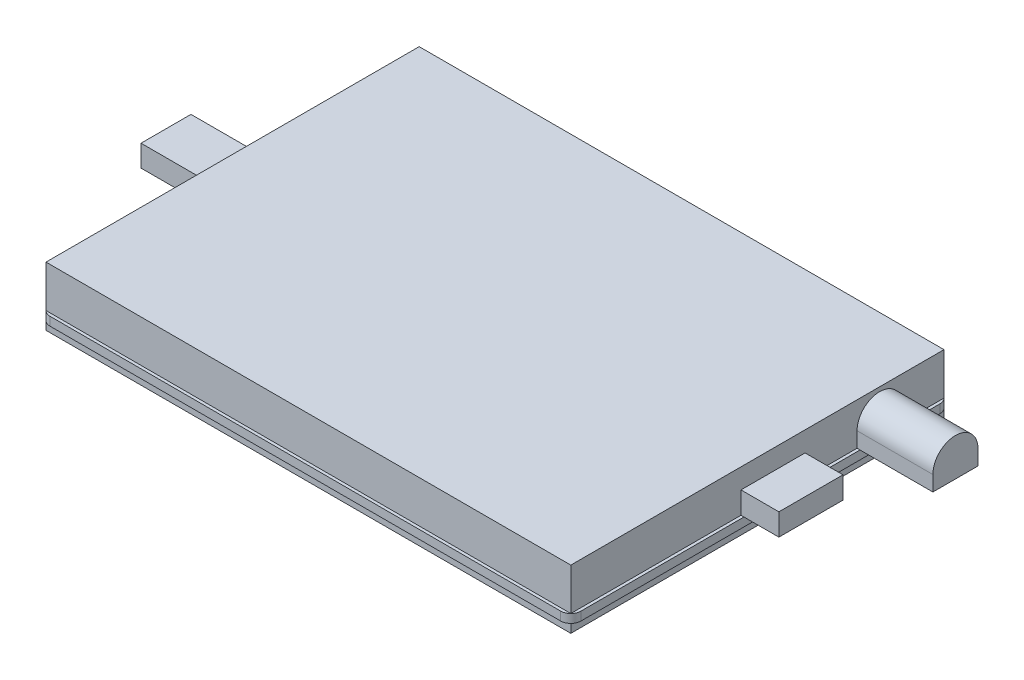
ISO-10303-21;
HEADER;
FILE_DESCRIPTION(('STEP AP214'),'2;1');
FILE_NAME('part.step','',(''),(''),'','','');
FILE_SCHEMA(('AUTOMOTIVE_DESIGN { 1 0 10303 214 1 1 1 1 }'));
ENDSEC;
DATA;
#1=APPLICATION_CONTEXT('core data for automotive mechanical design processes');
#2=APPLICATION_PROTOCOL_DEFINITION('international standard','automotive_design',2000,#1);
#3=PRODUCT_CONTEXT('',#1,'mechanical');
#4=PRODUCT('Part','Part','',(#3));
#5=PRODUCT_RELATED_PRODUCT_CATEGORY('part','',(#4));
#6=PRODUCT_DEFINITION_FORMATION('','',#4);
#7=PRODUCT_DEFINITION_CONTEXT('part definition',#1,'design');
#8=PRODUCT_DEFINITION('design','',#6,#7);
#9=PRODUCT_DEFINITION_SHAPE('','',#8);
#10=(LENGTH_UNIT() NAMED_UNIT(*) SI_UNIT(.MILLI.,.METRE.));
#11=(NAMED_UNIT(*) PLANE_ANGLE_UNIT() SI_UNIT($,.RADIAN.));
#12=(NAMED_UNIT(*) SI_UNIT($,.STERADIAN.) SOLID_ANGLE_UNIT());
#13=UNCERTAINTY_MEASURE_WITH_UNIT(LENGTH_MEASURE(1.E-05),#10,'distance_accuracy_value','');
#14=(GEOMETRIC_REPRESENTATION_CONTEXT(3) GLOBAL_UNCERTAINTY_ASSIGNED_CONTEXT((#13)) GLOBAL_UNIT_ASSIGNED_CONTEXT((#10,
#11,#12)) REPRESENTATION_CONTEXT('',''));
#15=CARTESIAN_POINT('',(0.,0.,0.));
#16=DIRECTION('',(0.,0.,1.));
#17=DIRECTION('',(1.,0.,0.));
#18=AXIS2_PLACEMENT_3D('',#15,#16,#17);
#19=CARTESIAN_POINT('',(-51.9142135623731,-1.7,36.9142135623731));
#20=DIRECTION('',(-1.,0.,0.));
#21=DIRECTION('',(0.,0.,1.));
#22=AXIS2_PLACEMENT_3D('',#19,#20,#21);
#23=PLANE('',#22);
#24=DIRECTION('',(0.,1.,0.));
#25=VECTOR('',#24,1.);
#26=CARTESIAN_POINT('',(-51.9142135623731,-1.7,36.9142135623731));
#27=LINE('',#26,#25);
#28=CARTESIAN_POINT('',(-51.9142135623731,-1.7,36.9142135623731));
#29=VERTEX_POINT('',#28);
#30=CARTESIAN_POINT('',(-51.9142135623731,10.,36.9142135623731));
#31=VERTEX_POINT('',#30);
#32=EDGE_CURVE('E59',#29,#31,#27,.T.);
#33=ORIENTED_EDGE('',*,*,#32,.T.);
#34=DIRECTION('',(0.,0.,1.));
#35=VECTOR('',#34,1.);
#36=CARTESIAN_POINT('',(-51.9142135623731,10.,36.9142135623731));
#37=LINE('',#36,#35);
#38=CARTESIAN_POINT('',(-51.9142135623731,10.,-36.9142135623731));
#39=VERTEX_POINT('',#38);
#40=EDGE_CURVE('E260',#39,#31,#37,.T.);
#41=ORIENTED_EDGE('',*,*,#40,.F.);
#42=DIRECTION('',(0.,1.,0.));
#43=VECTOR('',#42,1.);
#44=CARTESIAN_POINT('',(-51.9142135623731,-1.7,-36.9142135623731));
#45=LINE('',#44,#43);
#46=CARTESIAN_POINT('',(-51.9142135623731,-1.7,-36.9142135623731));
#47=VERTEX_POINT('',#46);
#48=EDGE_CURVE('E278',#47,#39,#45,.T.);
#49=ORIENTED_EDGE('',*,*,#48,.F.);
#50=DIRECTION('',(0.,0.,1.));
#51=VECTOR('',#50,1.);
#52=CARTESIAN_POINT('',(-51.9142135623731,-1.7,36.9142135623731));
#53=LINE('',#52,#51);
#54=EDGE_CURVE('E272',#47,#29,#53,.T.);
#55=ORIENTED_EDGE('',*,*,#54,.T.);
#56=EDGE_LOOP('',(#33,#41,#49,#55));
#57=FACE_BOUND('',#56,.T.);
#58=DIRECTION('',(0.,0.,1.));
#59=VECTOR('',#58,1.);
#60=CARTESIAN_POINT('',(-51.9142135623731,1.7,-6.76521605498692));
#61=LINE('',#60,#59);
#62=CARTESIAN_POINT('',(-51.9142135623731,1.7,-6.76521605498692));
#63=VERTEX_POINT('',#62);
#64=CARTESIAN_POINT('',(-51.9142135623731,1.7,3.11570686995156));
#65=VERTEX_POINT('',#64);
#66=EDGE_CURVE('E301',#63,#65,#61,.T.);
#67=ORIENTED_EDGE('',*,*,#66,.F.);
#68=DIRECTION('',(0.,-1.,0.));
#69=VECTOR('',#68,1.);
#70=CARTESIAN_POINT('',(-51.9142135623731,5.96902305784397,-6.76521605498692));
#71=LINE('',#70,#69);
#72=CARTESIAN_POINT('',(-51.9142135623731,5.96902305784397,-6.76521605498692));
#73=VERTEX_POINT('',#72);
#74=EDGE_CURVE('E188',#73,#63,#71,.T.);
#75=ORIENTED_EDGE('',*,*,#74,.F.);
#76=DIRECTION('',(0.,0.,-1.));
#77=VECTOR('',#76,1.);
#78=CARTESIAN_POINT('',(-51.9142135623731,5.96902305784397,3.11570686995156));
#79=LINE('',#78,#77);
#80=CARTESIAN_POINT('',(-51.9142135623731,5.96902305784397,3.11570686995156));
#81=VERTEX_POINT('',#80);
#82=EDGE_CURVE('E184',#81,#73,#79,.T.);
#83=ORIENTED_EDGE('',*,*,#82,.F.);
#84=DIRECTION('',(0.,1.,0.));
#85=VECTOR('',#84,1.);
#86=CARTESIAN_POINT('',(-51.9142135623731,1.7,3.11570686995156));
#87=LINE('',#86,#85);
#88=EDGE_CURVE('E303',#65,#81,#87,.T.);
#89=ORIENTED_EDGE('',*,*,#88,.F.);
#90=EDGE_LOOP('',(#67,#75,#83,#89));
#91=FACE_BOUND('',#90,.T.);
#92=ADVANCED_FACE('F50',(#57,#91),#23,.T.);
#93=CARTESIAN_POINT('',(51.9142135623731,-1.7,36.9142135623731));
#94=DIRECTION('',(1.,0.,0.));
#95=DIRECTION('',(0.,0.,-1.));
#96=AXIS2_PLACEMENT_3D('',#93,#94,#95);
#97=PLANE('',#96);
#98=DIRECTION('',(0.,0.,-1.));
#99=VECTOR('',#98,1.);
#100=CARTESIAN_POINT('',(51.9142135623731,1.7,-19.7174150401493));
#101=LINE('',#100,#99);
#102=CARTESIAN_POINT('',(51.9142135623731,1.7,-19.7174150401493));
#103=VERTEX_POINT('',#102);
#104=CARTESIAN_POINT('',(51.9142135623731,1.7,-28.6437490665321));
#105=VERTEX_POINT('',#104);
#106=EDGE_CURVE('E193',#103,#105,#101,.T.);
#107=ORIENTED_EDGE('',*,*,#106,.F.);
#108=DIRECTION('',(0.,-1.,0.));
#109=VECTOR('',#108,1.);
#110=CARTESIAN_POINT('',(51.9142135623731,4.69933782372103,-19.7174150401493));
#111=LINE('',#110,#109);
#112=CARTESIAN_POINT('',(51.9142135623731,4.69933782372103,-19.7174150401493));
#113=VERTEX_POINT('',#112);
#114=EDGE_CURVE('E190',#113,#103,#111,.T.);
#115=ORIENTED_EDGE('',*,*,#114,.F.);
#116=CARTESIAN_POINT('',(51.9142135623731,4.69933782372103,-24.1805820533407));
#117=DIRECTION('',(1.,0.,0.));
#118=DIRECTION('',(0.,0.,-1.));
#119=AXIS2_PLACEMENT_3D('',#116,#117,#118);
#120=CIRCLE('',#119,4.46316701319141);
#121=CARTESIAN_POINT('',(51.9142135623731,4.69933782372103,-28.6437490665321));
#122=VERTEX_POINT('',#121);
#123=EDGE_CURVE('E202',#122,#113,#120,.T.);
#124=ORIENTED_EDGE('',*,*,#123,.F.);
#125=DIRECTION('',(0.,1.,0.));
#126=VECTOR('',#125,1.);
#127=CARTESIAN_POINT('',(51.9142135623731,1.7,-28.6437490665321));
#128=LINE('',#127,#126);
#129=EDGE_CURVE('E210',#105,#122,#128,.T.);
#130=ORIENTED_EDGE('',*,*,#129,.F.);
#131=EDGE_LOOP('',(#107,#115,#124,#130));
#132=FACE_BOUND('',#131,.T.);
#133=DIRECTION('',(0.,-1.,0.));
#134=VECTOR('',#133,1.);
#135=CARTESIAN_POINT('',(51.9142135623731,6.04405809878017,3.24589472397463));
#136=LINE('',#135,#134);
#137=CARTESIAN_POINT('',(51.9142135623731,6.04405809878017,3.24589472397463));
#138=VERTEX_POINT('',#137);
#139=CARTESIAN_POINT('',(51.9142135623731,1.7,3.24589472397463));
#140=VERTEX_POINT('',#139);
#141=EDGE_CURVE('E221',#138,#140,#136,.T.);
#142=ORIENTED_EDGE('',*,*,#141,.F.);
#143=DIRECTION('',(0.,0.,1.));
#144=VECTOR('',#143,1.);
#145=CARTESIAN_POINT('',(51.9142135623731,6.04405809878017,3.24589472397463));
#146=LINE('',#145,#144);
#147=CARTESIAN_POINT('',(51.9142135623731,6.04405809878017,-9.4285149320612));
#148=VERTEX_POINT('',#147);
#149=EDGE_CURVE('E226',#148,#138,#146,.T.);
#150=ORIENTED_EDGE('',*,*,#149,.F.);
#151=DIRECTION('',(0.,1.,0.));
#152=VECTOR('',#151,1.);
#153=CARTESIAN_POINT('',(51.9142135623731,6.04405809878017,-9.4285149320612));
#154=LINE('',#153,#152);
#155=CARTESIAN_POINT('',(51.9142135623731,1.7,-9.4285149320612));
#156=VERTEX_POINT('',#155);
#157=EDGE_CURVE('E238',#156,#148,#154,.T.);
#158=ORIENTED_EDGE('',*,*,#157,.F.);
#159=DIRECTION('',(0.,0.,-1.));
#160=VECTOR('',#159,1.);
#161=CARTESIAN_POINT('',(51.9142135623731,1.7,3.24589472397463));
#162=LINE('',#161,#160);
#163=EDGE_CURVE('E235',#140,#156,#162,.T.);
#164=ORIENTED_EDGE('',*,*,#163,.F.);
#165=EDGE_LOOP('',(#142,#150,#158,#164));
#166=FACE_BOUND('',#165,.T.);
#167=DIRECTION('',(0.,1.,0.));
#168=VECTOR('',#167,1.);
#169=CARTESIAN_POINT('',(51.9142135623731,-1.7,-36.9142135623731));
#170=LINE('',#169,#168);
#171=CARTESIAN_POINT('',(51.9142135623731,-1.7,-36.9142135623731));
#172=VERTEX_POINT('',#171);
#173=CARTESIAN_POINT('',(51.9142135623731,10.,-36.9142135623731));
#174=VERTEX_POINT('',#173);
#175=EDGE_CURVE('E54',#172,#174,#170,.T.);
#176=ORIENTED_EDGE('',*,*,#175,.T.);
#177=DIRECTION('',(0.,0.,-1.));
#178=VECTOR('',#177,1.);
#179=CARTESIAN_POINT('',(51.9142135623731,10.,36.9142135623731));
#180=LINE('',#179,#178);
#181=CARTESIAN_POINT('',(51.9142135623731,10.,36.9142135623731));
#182=VERTEX_POINT('',#181);
#183=EDGE_CURVE('E254',#182,#174,#180,.T.);
#184=ORIENTED_EDGE('',*,*,#183,.F.);
#185=DIRECTION('',(0.,1.,0.));
#186=VECTOR('',#185,1.);
#187=CARTESIAN_POINT('',(51.9142135623731,-1.7,36.9142135623731));
#188=LINE('',#187,#186);
#189=CARTESIAN_POINT('',(51.9142135623731,-1.7,36.9142135623731));
#190=VERTEX_POINT('',#189);
#191=EDGE_CURVE('E12',#190,#182,#188,.T.);
#192=ORIENTED_EDGE('',*,*,#191,.F.);
#193=DIRECTION('',(0.,0.,-1.));
#194=VECTOR('',#193,1.);
#195=CARTESIAN_POINT('',(51.9142135623731,-1.7,36.9142135623731));
#196=LINE('',#195,#194);
#197=EDGE_CURVE('E266',#190,#172,#196,.T.);
#198=ORIENTED_EDGE('',*,*,#197,.T.);
#199=EDGE_LOOP('',(#176,#184,#192,#198));
#200=FACE_BOUND('',#199,.T.);
#201=ADVANCED_FACE('F52',(#132,#166,#200),#97,.T.);
#202=CARTESIAN_POINT('',(-51.9142135623731,-1.7,36.9142135623731));
#203=DIRECTION('',(0.,0.,1.));
#204=DIRECTION('',(1.,0.,0.));
#205=AXIS2_PLACEMENT_3D('',#202,#203,#204);
#206=PLANE('',#205);
#207=ORIENTED_EDGE('',*,*,#191,.T.);
#208=DIRECTION('',(1.,0.,0.));
#209=VECTOR('',#208,1.);
#210=CARTESIAN_POINT('',(-51.9142135623731,10.,36.9142135623731));
#211=LINE('',#210,#209);
#212=EDGE_CURVE('E263',#31,#182,#211,.T.);
#213=ORIENTED_EDGE('',*,*,#212,.F.);
#214=ORIENTED_EDGE('',*,*,#32,.F.);
#215=DIRECTION('',(1.,0.,0.));
#216=VECTOR('',#215,1.);
#217=CARTESIAN_POINT('',(-51.9142135623731,-1.7,36.9142135623731));
#218=LINE('',#217,#216);
#219=EDGE_CURVE('E275',#29,#190,#218,.T.);
#220=ORIENTED_EDGE('',*,*,#219,.T.);
#221=EDGE_LOOP('',(#207,#213,#214,#220));
#222=FACE_BOUND('',#221,.T.);
#223=ADVANCED_FACE('F291',(#222),#206,.T.);
#224=CARTESIAN_POINT('',(-51.9142135623731,-1.7,-36.9142135623731));
#225=DIRECTION('',(0.,0.,-1.));
#226=DIRECTION('',(-1.,0.,0.));
#227=AXIS2_PLACEMENT_3D('',#224,#225,#226);
#228=PLANE('',#227);
#229=ORIENTED_EDGE('',*,*,#48,.T.);
#230=DIRECTION('',(-1.,0.,0.));
#231=VECTOR('',#230,1.);
#232=CARTESIAN_POINT('',(-51.9142135623731,10.,-36.9142135623731));
#233=LINE('',#232,#231);
#234=EDGE_CURVE('E257',#174,#39,#233,.T.);
#235=ORIENTED_EDGE('',*,*,#234,.F.);
#236=ORIENTED_EDGE('',*,*,#175,.F.);
#237=DIRECTION('',(-1.,0.,0.));
#238=VECTOR('',#237,1.);
#239=CARTESIAN_POINT('',(-51.9142135623731,-1.7,-36.9142135623731));
#240=LINE('',#239,#238);
#241=EDGE_CURVE('E269',#172,#47,#240,.T.);
#242=ORIENTED_EDGE('',*,*,#241,.T.);
#243=EDGE_LOOP('',(#229,#235,#236,#242));
#244=FACE_BOUND('',#243,.T.);
#245=ADVANCED_FACE('F285',(#244),#228,.T.);
#246=CARTESIAN_POINT('',(0.,-1.7,0.));
#247=DIRECTION('',(0.,-1.,0.));
#248=DIRECTION('',(0.,0.,-1.));
#249=AXIS2_PLACEMENT_3D('',#246,#247,#248);
#250=PLANE('',#249);
#251=ORIENTED_EDGE('',*,*,#197,.F.);
#252=ORIENTED_EDGE('',*,*,#219,.F.);
#253=ORIENTED_EDGE('',*,*,#54,.F.);
#254=ORIENTED_EDGE('',*,*,#241,.F.);
#255=EDGE_LOOP('',(#251,#252,#253,#254));
#256=FACE_BOUND('',#255,.T.);
#257=ADVANCED_FACE('F294',(#256),#250,.T.);
#258=CARTESIAN_POINT('',(0.,10.,0.));
#259=DIRECTION('',(0.,-1.,0.));
#260=DIRECTION('',(0.,0.,-1.));
#261=AXIS2_PLACEMENT_3D('',#258,#259,#260);
#262=PLANE('',#261);
#263=ORIENTED_EDGE('',*,*,#183,.T.);
#264=ORIENTED_EDGE('',*,*,#234,.T.);
#265=ORIENTED_EDGE('',*,*,#40,.T.);
#266=ORIENTED_EDGE('',*,*,#212,.T.);
#267=EDGE_LOOP('',(#263,#264,#265,#266));
#268=FACE_BOUND('',#267,.T.);
#269=ADVANCED_FACE('F288',(#268),#262,.F.);
#270=CARTESIAN_POINT('',(59.4142135623731,6.04405809878017,3.24589472397463));
#271=DIRECTION('',(0.,0.,-1.));
#272=DIRECTION('',(0.,1.,0.));
#273=AXIS2_PLACEMENT_3D('',#270,#271,#272);
#274=PLANE('',#273);
#275=ORIENTED_EDGE('',*,*,#141,.T.);
#276=DIRECTION('',(-1.,0.,0.));
#277=VECTOR('',#276,1.);
#278=CARTESIAN_POINT('',(59.4142135623731,1.7,3.24589472397463));
#279=LINE('',#278,#277);
#280=CARTESIAN_POINT('',(59.4142135623731,1.7,3.24589472397463));
#281=VERTEX_POINT('',#280);
#282=EDGE_CURVE('E251',#281,#140,#279,.T.);
#283=ORIENTED_EDGE('',*,*,#282,.F.);
#284=DIRECTION('',(0.,-1.,0.));
#285=VECTOR('',#284,1.);
#286=CARTESIAN_POINT('',(59.4142135623731,6.04405809878017,3.24589472397463));
#287=LINE('',#286,#285);
#288=CARTESIAN_POINT('',(59.4142135623731,6.04405809878017,3.24589472397463));
#289=VERTEX_POINT('',#288);
#290=EDGE_CURVE('E222',#289,#281,#287,.T.);
#291=ORIENTED_EDGE('',*,*,#290,.F.);
#292=DIRECTION('',(-1.,0.,0.));
#293=VECTOR('',#292,1.);
#294=CARTESIAN_POINT('',(59.4142135623731,6.04405809878017,3.24589472397463));
#295=LINE('',#294,#293);
#296=EDGE_CURVE('E232',#289,#138,#295,.T.);
#297=ORIENTED_EDGE('',*,*,#296,.T.);
#298=EDGE_LOOP('',(#275,#283,#291,#297));
#299=FACE_BOUND('',#298,.T.);
#300=ADVANCED_FACE('F362',(#299),#274,.F.);
#301=CARTESIAN_POINT('',(59.4142135623731,1.7,3.24589472397463));
#302=DIRECTION('',(0.,1.,0.));
#303=DIRECTION('',(0.,0.,1.));
#304=AXIS2_PLACEMENT_3D('',#301,#302,#303);
#305=PLANE('',#304);
#306=ORIENTED_EDGE('',*,*,#163,.T.);
#307=DIRECTION('',(-1.,0.,0.));
#308=VECTOR('',#307,1.);
#309=CARTESIAN_POINT('',(59.4142135623731,1.7,-9.4285149320612));
#310=LINE('',#309,#308);
#311=CARTESIAN_POINT('',(59.4142135623731,1.7,-9.4285149320612));
#312=VERTEX_POINT('',#311);
#313=EDGE_CURVE('E248',#312,#156,#310,.T.);
#314=ORIENTED_EDGE('',*,*,#313,.F.);
#315=DIRECTION('',(0.,0.,-1.));
#316=VECTOR('',#315,1.);
#317=CARTESIAN_POINT('',(59.4142135623731,1.7,3.24589472397463));
#318=LINE('',#317,#316);
#319=EDGE_CURVE('E225',#281,#312,#318,.T.);
#320=ORIENTED_EDGE('',*,*,#319,.F.);
#321=ORIENTED_EDGE('',*,*,#282,.T.);
#322=EDGE_LOOP('',(#306,#314,#320,#321));
#323=FACE_BOUND('',#322,.T.);
#324=ADVANCED_FACE('F358',(#323),#305,.F.);
#325=CARTESIAN_POINT('',(59.4142135623731,6.04405809878017,-9.4285149320612));
#326=DIRECTION('',(0.,0.,1.));
#327=DIRECTION('',(1.,0.,0.));
#328=AXIS2_PLACEMENT_3D('',#325,#326,#327);
#329=PLANE('',#328);
#330=ORIENTED_EDGE('',*,*,#157,.T.);
#331=DIRECTION('',(-1.,0.,0.));
#332=VECTOR('',#331,1.);
#333=CARTESIAN_POINT('',(59.4142135623731,6.04405809878017,-9.4285149320612));
#334=LINE('',#333,#332);
#335=CARTESIAN_POINT('',(59.4142135623731,6.04405809878017,-9.4285149320612));
#336=VERTEX_POINT('',#335);
#337=EDGE_CURVE('E245',#336,#148,#334,.T.);
#338=ORIENTED_EDGE('',*,*,#337,.F.);
#339=DIRECTION('',(0.,1.,0.));
#340=VECTOR('',#339,1.);
#341=CARTESIAN_POINT('',(59.4142135623731,6.04405809878017,-9.4285149320612));
#342=LINE('',#341,#340);
#343=EDGE_CURVE('E228',#312,#336,#342,.T.);
#344=ORIENTED_EDGE('',*,*,#343,.F.);
#345=ORIENTED_EDGE('',*,*,#313,.T.);
#346=EDGE_LOOP('',(#330,#338,#344,#345));
#347=FACE_BOUND('',#346,.T.);
#348=ADVANCED_FACE('F354',(#347),#329,.F.);
#349=CARTESIAN_POINT('',(59.4142135623731,6.04405809878017,3.24589472397463));
#350=DIRECTION('',(0.,-1.,0.));
#351=DIRECTION('',(0.,0.,-1.));
#352=AXIS2_PLACEMENT_3D('',#349,#350,#351);
#353=PLANE('',#352);
#354=ORIENTED_EDGE('',*,*,#149,.T.);
#355=ORIENTED_EDGE('',*,*,#296,.F.);
#356=DIRECTION('',(0.,0.,1.));
#357=VECTOR('',#356,1.);
#358=CARTESIAN_POINT('',(59.4142135623731,6.04405809878017,3.24589472397463));
#359=LINE('',#358,#357);
#360=EDGE_CURVE('E230',#336,#289,#359,.T.);
#361=ORIENTED_EDGE('',*,*,#360,.F.);
#362=ORIENTED_EDGE('',*,*,#337,.T.);
#363=EDGE_LOOP('',(#354,#355,#361,#362));
#364=FACE_BOUND('',#363,.T.);
#365=ADVANCED_FACE('F350',(#364),#353,.F.);
#366=CARTESIAN_POINT('',(59.4142135623731,0.,0.));
#367=DIRECTION('',(1.,0.,0.));
#368=DIRECTION('',(0.,0.,-1.));
#369=AXIS2_PLACEMENT_3D('',#366,#367,#368);
#370=PLANE('',#369);
#371=ORIENTED_EDGE('',*,*,#290,.T.);
#372=ORIENTED_EDGE('',*,*,#319,.T.);
#373=ORIENTED_EDGE('',*,*,#343,.T.);
#374=ORIENTED_EDGE('',*,*,#360,.T.);
#375=EDGE_LOOP('',(#371,#372,#373,#374));
#376=FACE_BOUND('',#375,.T.);
#377=ADVANCED_FACE('F346',(#376),#370,.T.);
#378=CARTESIAN_POINT('',(66.9142135623731,4.69933782372103,-19.7174150401493));
#379=DIRECTION('',(0.,0.,-1.));
#380=DIRECTION('',(-1.,0.,0.));
#381=AXIS2_PLACEMENT_3D('',#378,#379,#380);
#382=PLANE('',#381);
#383=ORIENTED_EDGE('',*,*,#114,.T.);
#384=DIRECTION('',(-1.,0.,0.));
#385=VECTOR('',#384,1.);
#386=CARTESIAN_POINT('',(66.9142135623731,1.7,-19.7174150401493));
#387=LINE('',#386,#385);
#388=CARTESIAN_POINT('',(66.9142135623731,1.7,-19.7174150401493));
#389=VERTEX_POINT('',#388);
#390=EDGE_CURVE('E219',#389,#103,#387,.T.);
#391=ORIENTED_EDGE('',*,*,#390,.F.);
#392=DIRECTION('',(0.,-1.,0.));
#393=VECTOR('',#392,1.);
#394=CARTESIAN_POINT('',(66.9142135623731,4.69933782372103,-19.7174150401493));
#395=LINE('',#394,#393);
#396=CARTESIAN_POINT('',(66.9142135623731,4.69933782372103,-19.7174150401493));
#397=VERTEX_POINT('',#396);
#398=EDGE_CURVE('E198',#397,#389,#395,.T.);
#399=ORIENTED_EDGE('',*,*,#398,.F.);
#400=DIRECTION('',(-1.,0.,0.));
#401=VECTOR('',#400,1.);
#402=CARTESIAN_POINT('',(66.9142135623731,4.69933782372103,-19.7174150401493));
#403=LINE('',#402,#401);
#404=EDGE_CURVE('E207',#397,#113,#403,.T.);
#405=ORIENTED_EDGE('',*,*,#404,.T.);
#406=EDGE_LOOP('',(#383,#391,#399,#405));
#407=FACE_BOUND('',#406,.T.);
#408=ADVANCED_FACE('F342',(#407),#382,.F.);
#409=CARTESIAN_POINT('',(66.9142135623731,1.7,-19.7174150401493));
#410=DIRECTION('',(0.,1.,0.));
#411=DIRECTION('',(0.,0.,1.));
#412=AXIS2_PLACEMENT_3D('',#409,#410,#411);
#413=PLANE('',#412);
#414=ORIENTED_EDGE('',*,*,#106,.T.);
#415=DIRECTION('',(-1.,0.,0.));
#416=VECTOR('',#415,1.);
#417=CARTESIAN_POINT('',(66.9142135623731,1.7,-28.6437490665321));
#418=LINE('',#417,#416);
#419=CARTESIAN_POINT('',(66.9142135623731,1.7,-28.6437490665321));
#420=VERTEX_POINT('',#419);
#421=EDGE_CURVE('E216',#420,#105,#418,.T.);
#422=ORIENTED_EDGE('',*,*,#421,.F.);
#423=DIRECTION('',(0.,0.,-1.));
#424=VECTOR('',#423,1.);
#425=CARTESIAN_POINT('',(66.9142135623731,1.7,-19.7174150401493));
#426=LINE('',#425,#424);
#427=EDGE_CURVE('E201',#389,#420,#426,.T.);
#428=ORIENTED_EDGE('',*,*,#427,.F.);
#429=ORIENTED_EDGE('',*,*,#390,.T.);
#430=EDGE_LOOP('',(#414,#422,#428,#429));
#431=FACE_BOUND('',#430,.T.);
#432=ADVANCED_FACE('F338',(#431),#413,.F.);
#433=CARTESIAN_POINT('',(66.9142135623731,1.7,-28.6437490665321));
#434=DIRECTION('',(0.,0.,1.));
#435=DIRECTION('',(1.,0.,0.));
#436=AXIS2_PLACEMENT_3D('',#433,#434,#435);
#437=PLANE('',#436);
#438=ORIENTED_EDGE('',*,*,#129,.T.);
#439=DIRECTION('',(-1.,0.,0.));
#440=VECTOR('',#439,1.);
#441=CARTESIAN_POINT('',(66.9142135623731,4.69933782372103,-28.6437490665321));
#442=LINE('',#441,#440);
#443=CARTESIAN_POINT('',(66.9142135623731,4.69933782372103,-28.6437490665321));
#444=VERTEX_POINT('',#443);
#445=EDGE_CURVE('E75',#444,#122,#442,.T.);
#446=ORIENTED_EDGE('',*,*,#445,.F.);
#447=DIRECTION('',(0.,1.,0.));
#448=VECTOR('',#447,1.);
#449=CARTESIAN_POINT('',(66.9142135623731,1.7,-28.6437490665321));
#450=LINE('',#449,#448);
#451=EDGE_CURVE('E204',#420,#444,#450,.T.);
#452=ORIENTED_EDGE('',*,*,#451,.F.);
#453=ORIENTED_EDGE('',*,*,#421,.T.);
#454=EDGE_LOOP('',(#438,#446,#452,#453));
#455=FACE_BOUND('',#454,.T.);
#456=ADVANCED_FACE('F335',(#455),#437,.F.);
#457=CARTESIAN_POINT('',(66.9142135623731,4.69933782372103,-24.1805820533407));
#458=DIRECTION('',(-1.,0.,0.));
#459=DIRECTION('',(0.,0.,1.));
#460=AXIS2_PLACEMENT_3D('',#457,#458,#459);
#461=CYLINDRICAL_SURFACE('',#460,4.46316701319141);
#462=ORIENTED_EDGE('',*,*,#123,.T.);
#463=ORIENTED_EDGE('',*,*,#404,.F.);
#464=CARTESIAN_POINT('',(66.9142135623731,4.69933782372103,-24.1805820533407));
#465=DIRECTION('',(1.,0.,0.));
#466=DIRECTION('',(0.,0.,-1.));
#467=AXIS2_PLACEMENT_3D('',#464,#465,#466);
#468=CIRCLE('',#467,4.46316701319141);
#469=EDGE_CURVE('E206',#444,#397,#468,.T.);
#470=ORIENTED_EDGE('',*,*,#469,.F.);
#471=ORIENTED_EDGE('',*,*,#445,.T.);
#472=EDGE_LOOP('',(#462,#463,#470,#471));
#473=FACE_BOUND('',#472,.T.);
#474=ADVANCED_FACE('F331',(#473),#461,.T.);
#475=CARTESIAN_POINT('',(66.9142135623731,4.69933782372103,-24.1805820533407));
#476=DIRECTION('',(1.,0.,0.));
#477=DIRECTION('',(0.,0.,-1.));
#478=AXIS2_PLACEMENT_3D('',#475,#476,#477);
#479=PLANE('',#478);
#480=ORIENTED_EDGE('',*,*,#398,.T.);
#481=ORIENTED_EDGE('',*,*,#427,.T.);
#482=ORIENTED_EDGE('',*,*,#451,.T.);
#483=ORIENTED_EDGE('',*,*,#469,.T.);
#484=EDGE_LOOP('',(#480,#481,#482,#483));
#485=FACE_BOUND('',#484,.T.);
#486=ADVANCED_FACE('F328',(#485),#479,.T.);
#487=CARTESIAN_POINT('',(-66.9142135623731,5.96902305784397,-6.76521605498692));
#488=DIRECTION('',(0.,0.,1.));
#489=DIRECTION('',(0.,-1.,0.));
#490=AXIS2_PLACEMENT_3D('',#487,#488,#489);
#491=PLANE('',#490);
#492=ORIENTED_EDGE('',*,*,#74,.T.);
#493=DIRECTION('',(1.,0.,0.));
#494=VECTOR('',#493,1.);
#495=CARTESIAN_POINT('',(-66.9142135623731,1.7,-6.76521605498692));
#496=LINE('',#495,#494);
#497=CARTESIAN_POINT('',(-66.9142135623731,1.7,-6.76521605498692));
#498=VERTEX_POINT('',#497);
#499=EDGE_CURVE('E169',#498,#63,#496,.T.);
#500=ORIENTED_EDGE('',*,*,#499,.F.);
#501=DIRECTION('',(0.,-1.,0.));
#502=VECTOR('',#501,1.);
#503=CARTESIAN_POINT('',(-66.9142135623731,5.96902305784397,-6.76521605498692));
#504=LINE('',#503,#502);
#505=CARTESIAN_POINT('',(-66.9142135623731,5.96902305784397,-6.76521605498692));
#506=VERTEX_POINT('',#505);
#507=EDGE_CURVE('E176',#506,#498,#504,.T.);
#508=ORIENTED_EDGE('',*,*,#507,.F.);
#509=DIRECTION('',(1.,0.,0.));
#510=VECTOR('',#509,1.);
#511=CARTESIAN_POINT('',(-66.9142135623731,5.96902305784397,-6.76521605498692));
#512=LINE('',#511,#510);
#513=EDGE_CURVE('E310',#506,#73,#512,.T.);
#514=ORIENTED_EDGE('',*,*,#513,.T.);
#515=EDGE_LOOP('',(#492,#500,#508,#514));
#516=FACE_BOUND('',#515,.T.);
#517=ADVANCED_FACE('F186',(#516),#491,.F.);
#518=CARTESIAN_POINT('',(-66.9142135623731,1.7,-6.76521605498692));
#519=DIRECTION('',(0.,1.,0.));
#520=DIRECTION('',(0.,0.,1.));
#521=AXIS2_PLACEMENT_3D('',#518,#519,#520);
#522=PLANE('',#521);
#523=ORIENTED_EDGE('',*,*,#66,.T.);
#524=DIRECTION('',(1.,0.,0.));
#525=VECTOR('',#524,1.);
#526=CARTESIAN_POINT('',(-66.9142135623731,1.7,3.11570686995156));
#527=LINE('',#526,#525);
#528=CARTESIAN_POINT('',(-66.9142135623731,1.7,3.11570686995156));
#529=VERTEX_POINT('',#528);
#530=EDGE_CURVE('E172',#529,#65,#527,.T.);
#531=ORIENTED_EDGE('',*,*,#530,.F.);
#532=DIRECTION('',(0.,0.,1.));
#533=VECTOR('',#532,1.);
#534=CARTESIAN_POINT('',(-66.9142135623731,1.7,-6.76521605498692));
#535=LINE('',#534,#533);
#536=EDGE_CURVE('E165',#498,#529,#535,.T.);
#537=ORIENTED_EDGE('',*,*,#536,.F.);
#538=ORIENTED_EDGE('',*,*,#499,.T.);
#539=EDGE_LOOP('',(#523,#531,#537,#538));
#540=FACE_BOUND('',#539,.T.);
#541=ADVANCED_FACE('F167',(#540),#522,.F.);
#542=CARTESIAN_POINT('',(-66.9142135623731,1.7,3.11570686995156));
#543=DIRECTION('',(0.,0.,-1.));
#544=DIRECTION('',(-1.,0.,0.));
#545=AXIS2_PLACEMENT_3D('',#542,#543,#544);
#546=PLANE('',#545);
#547=ORIENTED_EDGE('',*,*,#88,.T.);
#548=DIRECTION('',(1.,0.,0.));
#549=VECTOR('',#548,1.);
#550=CARTESIAN_POINT('',(-66.9142135623731,5.96902305784397,3.11570686995156));
#551=LINE('',#550,#549);
#552=CARTESIAN_POINT('',(-66.9142135623731,5.96902305784397,3.11570686995156));
#553=VERTEX_POINT('',#552);
#554=EDGE_CURVE('E67',#553,#81,#551,.T.);
#555=ORIENTED_EDGE('',*,*,#554,.F.);
#556=DIRECTION('',(0.,1.,0.));
#557=VECTOR('',#556,1.);
#558=CARTESIAN_POINT('',(-66.9142135623731,1.7,3.11570686995156));
#559=LINE('',#558,#557);
#560=EDGE_CURVE('E175',#529,#553,#559,.T.);
#561=ORIENTED_EDGE('',*,*,#560,.F.);
#562=ORIENTED_EDGE('',*,*,#530,.T.);
#563=EDGE_LOOP('',(#547,#555,#561,#562));
#564=FACE_BOUND('',#563,.T.);
#565=ADVANCED_FACE('F313',(#564),#546,.F.);
#566=CARTESIAN_POINT('',(-66.9142135623731,5.96902305784397,3.11570686995156));
#567=DIRECTION('',(0.,-1.,0.));
#568=DIRECTION('',(0.,0.,-1.));
#569=AXIS2_PLACEMENT_3D('',#566,#567,#568);
#570=PLANE('',#569);
#571=ORIENTED_EDGE('',*,*,#82,.T.);
#572=ORIENTED_EDGE('',*,*,#513,.F.);
#573=DIRECTION('',(0.,0.,-1.));
#574=VECTOR('',#573,1.);
#575=CARTESIAN_POINT('',(-66.9142135623731,5.96902305784397,3.11570686995156));
#576=LINE('',#575,#574);
#577=EDGE_CURVE('E180',#553,#506,#576,.T.);
#578=ORIENTED_EDGE('',*,*,#577,.F.);
#579=ORIENTED_EDGE('',*,*,#554,.T.);
#580=EDGE_LOOP('',(#571,#572,#578,#579));
#581=FACE_BOUND('',#580,.T.);
#582=ADVANCED_FACE('F314',(#581),#570,.F.);
#583=CARTESIAN_POINT('',(-66.9142135623731,0.,0.));
#584=DIRECTION('',(-1.,0.,0.));
#585=DIRECTION('',(0.,0.,1.));
#586=AXIS2_PLACEMENT_3D('',#583,#584,#585);
#587=PLANE('',#586);
#588=ORIENTED_EDGE('',*,*,#507,.T.);
#589=ORIENTED_EDGE('',*,*,#536,.T.);
#590=ORIENTED_EDGE('',*,*,#560,.T.);
#591=ORIENTED_EDGE('',*,*,#577,.T.);
#592=EDGE_LOOP('',(#588,#589,#590,#591));
#593=FACE_BOUND('',#592,.T.);
#594=ADVANCED_FACE('F179',(#593),#587,.T.);
#595=CLOSED_SHELL('',(#92,#201,#223,#245,#257,#269,#300,#324,#348,#365,#377,#408,#432,#456,#474,
#486,#517,#541,#565,#582,#594));
#596=MANIFOLD_SOLID_BREP('B2',#595);
#597=CARTESIAN_POINT('',(50.5,1.7,-35.5));
#598=DIRECTION('',(0.,-1.,0.));
#599=DIRECTION('',(0.,0.,-1.));
#600=AXIS2_PLACEMENT_3D('',#597,#598,#599);
#601=CYLINDRICAL_SURFACE('',#600,2.);
#602=CARTESIAN_POINT('',(50.5,0.,-35.5));
#603=DIRECTION('',(0.,1.,0.));
#604=DIRECTION('',(0.,0.,-1.));
#605=AXIS2_PLACEMENT_3D('',#602,#603,#604);
#606=CIRCLE('',#605,2.);
#607=CARTESIAN_POINT('',(52.5,0.,-35.5));
#608=VERTEX_POINT('',#607);
#609=CARTESIAN_POINT('',(50.5,0.,-37.5));
#610=VERTEX_POINT('',#609);
#611=EDGE_CURVE('E614',#608,#610,#606,.T.);
#612=ORIENTED_EDGE('',*,*,#611,.T.);
#613=DIRECTION('',(0.,-1.,0.));
#614=VECTOR('',#613,1.);
#615=CARTESIAN_POINT('',(50.5,1.7,-37.5));
#616=LINE('',#615,#614);
#617=CARTESIAN_POINT('',(50.5,1.7,-37.5));
#618=VERTEX_POINT('',#617);
#619=EDGE_CURVE('E48',#618,#610,#616,.T.);
#620=ORIENTED_EDGE('',*,*,#619,.F.);
#621=CARTESIAN_POINT('',(50.5,1.7,-35.5));
#622=DIRECTION('',(0.,1.,0.));
#623=DIRECTION('',(0.,0.,-1.));
#624=AXIS2_PLACEMENT_3D('',#621,#622,#623);
#625=CIRCLE('',#624,2.);
#626=CARTESIAN_POINT('',(52.5,1.7,-35.5));
#627=VERTEX_POINT('',#626);
#628=EDGE_CURVE('E629',#627,#618,#625,.T.);
#629=ORIENTED_EDGE('',*,*,#628,.F.);
#630=DIRECTION('',(0.,-1.,0.));
#631=VECTOR('',#630,1.);
#632=CARTESIAN_POINT('',(52.5,1.7,-35.5));
#633=LINE('',#632,#631);
#634=EDGE_CURVE('E610',#627,#608,#633,.T.);
#635=ORIENTED_EDGE('',*,*,#634,.T.);
#636=EDGE_LOOP('',(#612,#620,#629,#635));
#637=FACE_BOUND('',#636,.T.);
#638=ADVANCED_FACE('F518',(#637),#601,.T.);
#639=CARTESIAN_POINT('',(-50.5,1.7,-37.5));
#640=DIRECTION('',(0.,0.,1.));
#641=DIRECTION('',(1.,0.,0.));
#642=AXIS2_PLACEMENT_3D('',#639,#640,#641);
#643=PLANE('',#642);
#644=DIRECTION('',(-1.,0.,0.));
#645=VECTOR('',#644,1.);
#646=CARTESIAN_POINT('',(-50.5,0.,-37.5));
#647=LINE('',#646,#645);
#648=CARTESIAN_POINT('',(-50.5,0.,-37.5));
#649=VERTEX_POINT('',#648);
#650=EDGE_CURVE('E617',#610,#649,#647,.T.);
#651=ORIENTED_EDGE('',*,*,#650,.T.);
#652=DIRECTION('',(0.,-1.,0.));
#653=VECTOR('',#652,1.);
#654=CARTESIAN_POINT('',(-50.5,1.7,-37.5));
#655=LINE('',#654,#653);
#656=CARTESIAN_POINT('',(-50.5,1.7,-37.5));
#657=VERTEX_POINT('',#656);
#658=EDGE_CURVE('E526',#657,#649,#655,.T.);
#659=ORIENTED_EDGE('',*,*,#658,.F.);
#660=DIRECTION('',(-1.,0.,0.));
#661=VECTOR('',#660,1.);
#662=CARTESIAN_POINT('',(-50.5,1.7,-37.5));
#663=LINE('',#662,#661);
#664=EDGE_CURVE('E577',#618,#657,#663,.T.);
#665=ORIENTED_EDGE('',*,*,#664,.F.);
#666=ORIENTED_EDGE('',*,*,#619,.T.);
#667=EDGE_LOOP('',(#651,#659,#665,#666));
#668=FACE_BOUND('',#667,.T.);
#669=ADVANCED_FACE('F710',(#668),#643,.F.);
#670=CARTESIAN_POINT('',(-50.5,1.7,-35.5));
#671=DIRECTION('',(0.,-1.,0.));
#672=DIRECTION('',(0.,0.,-1.));
#673=AXIS2_PLACEMENT_3D('',#670,#671,#672);
#674=CYLINDRICAL_SURFACE('',#673,2.);
#675=CARTESIAN_POINT('',(-50.5,0.,-35.5));
#676=DIRECTION('',(0.,1.,0.));
#677=DIRECTION('',(0.,0.,-1.));
#678=AXIS2_PLACEMENT_3D('',#675,#676,#677);
#679=CIRCLE('',#678,2.);
#680=CARTESIAN_POINT('',(-52.5,0.,-35.5));
#681=VERTEX_POINT('',#680);
#682=EDGE_CURVE('E620',#649,#681,#679,.T.);
#683=ORIENTED_EDGE('',*,*,#682,.T.);
#684=DIRECTION('',(0.,-1.,0.));
#685=VECTOR('',#684,1.);
#686=CARTESIAN_POINT('',(-52.5,1.7,-35.5));
#687=LINE('',#686,#685);
#688=CARTESIAN_POINT('',(-52.5,1.7,-35.5));
#689=VERTEX_POINT('',#688);
#690=EDGE_CURVE('E636',#689,#681,#687,.T.);
#691=ORIENTED_EDGE('',*,*,#690,.F.);
#692=CARTESIAN_POINT('',(-50.5,1.7,-35.5));
#693=DIRECTION('',(0.,1.,0.));
#694=DIRECTION('',(0.,0.,-1.));
#695=AXIS2_PLACEMENT_3D('',#692,#693,#694);
#696=CIRCLE('',#695,2.);
#697=EDGE_CURVE('E644',#657,#689,#696,.T.);
#698=ORIENTED_EDGE('',*,*,#697,.F.);
#699=ORIENTED_EDGE('',*,*,#658,.T.);
#700=EDGE_LOOP('',(#683,#691,#698,#699));
#701=FACE_BOUND('',#700,.T.);
#702=ADVANCED_FACE('F642',(#701),#674,.T.);
#703=CARTESIAN_POINT('',(-52.5,1.7,35.5));
#704=DIRECTION('',(1.,0.,0.));
#705=DIRECTION('',(0.,0.,-1.));
#706=AXIS2_PLACEMENT_3D('',#703,#704,#705);
#707=PLANE('',#706);
#708=DIRECTION('',(0.,0.,1.));
#709=VECTOR('',#708,1.);
#710=CARTESIAN_POINT('',(-52.5,0.,35.5));
#711=LINE('',#710,#709);
#712=CARTESIAN_POINT('',(-52.5,0.,35.5));
#713=VERTEX_POINT('',#712);
#714=EDGE_CURVE('E622',#681,#713,#711,.T.);
#715=ORIENTED_EDGE('',*,*,#714,.T.);
#716=DIRECTION('',(0.,-1.,0.));
#717=VECTOR('',#716,1.);
#718=CARTESIAN_POINT('',(-52.5,1.7,35.5));
#719=LINE('',#718,#717);
#720=CARTESIAN_POINT('',(-52.5,1.7,35.5));
#721=VERTEX_POINT('',#720);
#722=EDGE_CURVE('E633',#721,#713,#719,.T.);
#723=ORIENTED_EDGE('',*,*,#722,.F.);
#724=DIRECTION('',(0.,0.,1.));
#725=VECTOR('',#724,1.);
#726=CARTESIAN_POINT('',(-52.5,1.7,35.5));
#727=LINE('',#726,#725);
#728=EDGE_CURVE('E656',#689,#721,#727,.T.);
#729=ORIENTED_EDGE('',*,*,#728,.F.);
#730=ORIENTED_EDGE('',*,*,#690,.T.);
#731=EDGE_LOOP('',(#715,#723,#729,#730));
#732=FACE_BOUND('',#731,.T.);
#733=ADVANCED_FACE('F652',(#732),#707,.F.);
#734=CARTESIAN_POINT('',(-50.5,1.7,35.5));
#735=DIRECTION('',(0.,-1.,0.));
#736=DIRECTION('',(0.,0.,-1.));
#737=AXIS2_PLACEMENT_3D('',#734,#735,#736);
#738=CYLINDRICAL_SURFACE('',#737,2.);
#739=CARTESIAN_POINT('',(-50.5,0.,35.5));
#740=DIRECTION('',(0.,1.,0.));
#741=DIRECTION('',(0.,0.,-1.));
#742=AXIS2_PLACEMENT_3D('',#739,#740,#741);
#743=CIRCLE('',#742,2.);
#744=CARTESIAN_POINT('',(-50.5,0.,37.5));
#745=VERTEX_POINT('',#744);
#746=EDGE_CURVE('E624',#713,#745,#743,.T.);
#747=ORIENTED_EDGE('',*,*,#746,.T.);
#748=DIRECTION('',(0.,-1.,0.));
#749=VECTOR('',#748,1.);
#750=CARTESIAN_POINT('',(-50.5,1.7,37.5));
#751=LINE('',#750,#749);
#752=CARTESIAN_POINT('',(-50.5,1.7,37.5));
#753=VERTEX_POINT('',#752);
#754=EDGE_CURVE('E605',#753,#745,#751,.T.);
#755=ORIENTED_EDGE('',*,*,#754,.F.);
#756=CARTESIAN_POINT('',(-50.5,1.7,35.5));
#757=DIRECTION('',(0.,1.,0.));
#758=DIRECTION('',(0.,0.,-1.));
#759=AXIS2_PLACEMENT_3D('',#756,#757,#758);
#760=CIRCLE('',#759,2.);
#761=EDGE_CURVE('E596',#721,#753,#760,.T.);
#762=ORIENTED_EDGE('',*,*,#761,.F.);
#763=ORIENTED_EDGE('',*,*,#722,.T.);
#764=EDGE_LOOP('',(#747,#755,#762,#763));
#765=FACE_BOUND('',#764,.T.);
#766=ADVANCED_FACE('F655',(#765),#738,.T.);
#767=CARTESIAN_POINT('',(-50.5,1.7,37.5));
#768=DIRECTION('',(0.,0.,-1.));
#769=DIRECTION('',(-1.,0.,0.));
#770=AXIS2_PLACEMENT_3D('',#767,#768,#769);
#771=PLANE('',#770);
#772=DIRECTION('',(1.,0.,0.));
#773=VECTOR('',#772,1.);
#774=CARTESIAN_POINT('',(-50.5,0.,37.5));
#775=LINE('',#774,#773);
#776=CARTESIAN_POINT('',(50.5,0.,37.5));
#777=VERTEX_POINT('',#776);
#778=EDGE_CURVE('E604',#745,#777,#775,.T.);
#779=ORIENTED_EDGE('',*,*,#778,.T.);
#780=DIRECTION('',(0.,-1.,0.));
#781=VECTOR('',#780,1.);
#782=CARTESIAN_POINT('',(50.5,1.7,37.5));
#783=LINE('',#782,#781);
#784=CARTESIAN_POINT('',(50.5,1.7,37.5));
#785=VERTEX_POINT('',#784);
#786=EDGE_CURVE('E601',#785,#777,#783,.T.);
#787=ORIENTED_EDGE('',*,*,#786,.F.);
#788=DIRECTION('',(1.,0.,0.));
#789=VECTOR('',#788,1.);
#790=CARTESIAN_POINT('',(-50.5,1.7,37.5));
#791=LINE('',#790,#789);
#792=EDGE_CURVE('E590',#753,#785,#791,.T.);
#793=ORIENTED_EDGE('',*,*,#792,.F.);
#794=ORIENTED_EDGE('',*,*,#754,.T.);
#795=EDGE_LOOP('',(#779,#787,#793,#794));
#796=FACE_BOUND('',#795,.T.);
#797=ADVANCED_FACE('F602',(#796),#771,.F.);
#798=CARTESIAN_POINT('',(50.5,1.7,35.5));
#799=DIRECTION('',(0.,-1.,0.));
#800=DIRECTION('',(0.,0.,-1.));
#801=AXIS2_PLACEMENT_3D('',#798,#799,#800);
#802=CYLINDRICAL_SURFACE('',#801,2.);
#803=CARTESIAN_POINT('',(50.5,0.,35.5));
#804=DIRECTION('',(0.,1.,0.));
#805=DIRECTION('',(0.,0.,1.));
#806=AXIS2_PLACEMENT_3D('',#803,#804,#805);
#807=CIRCLE('',#806,2.);
#808=CARTESIAN_POINT('',(52.5,0.,35.5));
#809=VERTEX_POINT('',#808);
#810=EDGE_CURVE('E563',#777,#809,#807,.T.);
#811=ORIENTED_EDGE('',*,*,#810,.T.);
#812=DIRECTION('',(0.,-1.,0.));
#813=VECTOR('',#812,1.);
#814=CARTESIAN_POINT('',(52.5,1.7,35.5));
#815=LINE('',#814,#813);
#816=CARTESIAN_POINT('',(52.5,1.7,35.5));
#817=VERTEX_POINT('',#816);
#818=EDGE_CURVE('E606',#817,#809,#815,.T.);
#819=ORIENTED_EDGE('',*,*,#818,.F.);
#820=CARTESIAN_POINT('',(50.5,1.7,35.5));
#821=DIRECTION('',(0.,1.,0.));
#822=DIRECTION('',(0.,0.,1.));
#823=AXIS2_PLACEMENT_3D('',#820,#821,#822);
#824=CIRCLE('',#823,2.);
#825=EDGE_CURVE('E594',#785,#817,#824,.T.);
#826=ORIENTED_EDGE('',*,*,#825,.F.);
#827=ORIENTED_EDGE('',*,*,#786,.T.);
#828=EDGE_LOOP('',(#811,#819,#826,#827));
#829=FACE_BOUND('',#828,.T.);
#830=ADVANCED_FACE('F608',(#829),#802,.T.);
#831=CARTESIAN_POINT('',(52.5,1.7,35.5));
#832=DIRECTION('',(-1.,0.,0.));
#833=DIRECTION('',(0.,0.,1.));
#834=AXIS2_PLACEMENT_3D('',#831,#832,#833);
#835=PLANE('',#834);
#836=DIRECTION('',(0.,0.,-1.));
#837=VECTOR('',#836,1.);
#838=CARTESIAN_POINT('',(52.5,0.,35.5));
#839=LINE('',#838,#837);
#840=EDGE_CURVE('E569',#809,#608,#839,.T.);
#841=ORIENTED_EDGE('',*,*,#840,.T.);
#842=ORIENTED_EDGE('',*,*,#634,.F.);
#843=DIRECTION('',(0.,0.,-1.));
#844=VECTOR('',#843,1.);
#845=CARTESIAN_POINT('',(52.5,1.7,35.5));
#846=LINE('',#845,#844);
#847=EDGE_CURVE('E534',#817,#627,#846,.T.);
#848=ORIENTED_EDGE('',*,*,#847,.F.);
#849=ORIENTED_EDGE('',*,*,#818,.T.);
#850=EDGE_LOOP('',(#841,#842,#848,#849));
#851=FACE_BOUND('',#850,.T.);
#852=ADVANCED_FACE('F691',(#851),#835,.F.);
#853=CARTESIAN_POINT('',(50.5,1.7,-35.5));
#854=DIRECTION('',(0.,-1.,0.));
#855=DIRECTION('',(0.,0.,-1.));
#856=AXIS2_PLACEMENT_3D('',#853,#854,#855);
#857=PLANE('',#856);
#858=CARTESIAN_POINT('',(-48.,1.7,33.));
#859=DIRECTION('',(0.,1.,0.));
#860=DIRECTION('',(0.,0.,1.));
#861=AXIS2_PLACEMENT_3D('',#858,#859,#860);
#862=CIRCLE('',#861,2.);
#863=CARTESIAN_POINT('',(-48.,1.7,35.));
#864=VERTEX_POINT('',#863);
#865=EDGE_CURVE('E671',#864,#864,#862,.T.);
#866=ORIENTED_EDGE('',*,*,#865,.F.);
#867=EDGE_LOOP('',(#866));
#868=FACE_BOUND('',#867,.T.);
#869=CARTESIAN_POINT('',(-48.,1.7,-33.));
#870=DIRECTION('',(0.,1.,0.));
#871=DIRECTION('',(0.,0.,-1.));
#872=AXIS2_PLACEMENT_3D('',#869,#870,#871);
#873=CIRCLE('',#872,2.);
#874=CARTESIAN_POINT('',(-48.,1.7,-35.));
#875=VERTEX_POINT('',#874);
#876=EDGE_CURVE('E677',#875,#875,#873,.T.);
#877=ORIENTED_EDGE('',*,*,#876,.F.);
#878=EDGE_LOOP('',(#877));
#879=FACE_BOUND('',#878,.T.);
#880=CARTESIAN_POINT('',(48.,1.7,-33.));
#881=DIRECTION('',(0.,1.,0.));
#882=DIRECTION('',(0.,0.,1.));
#883=AXIS2_PLACEMENT_3D('',#880,#881,#882);
#884=CIRCLE('',#883,2.);
#885=CARTESIAN_POINT('',(48.,1.7,-31.));
#886=VERTEX_POINT('',#885);
#887=EDGE_CURVE('E665',#886,#886,#884,.T.);
#888=ORIENTED_EDGE('',*,*,#887,.F.);
#889=EDGE_LOOP('',(#888));
#890=FACE_BOUND('',#889,.T.);
#891=CARTESIAN_POINT('',(48.,1.7,33.));
#892=DIRECTION('',(0.,1.,0.));
#893=DIRECTION('',(0.,0.,-1.));
#894=AXIS2_PLACEMENT_3D('',#891,#892,#893);
#895=CIRCLE('',#894,2.);
#896=CARTESIAN_POINT('',(48.,1.7,31.));
#897=VERTEX_POINT('',#896);
#898=EDGE_CURVE('E618',#897,#897,#895,.T.);
#899=ORIENTED_EDGE('',*,*,#898,.F.);
#900=EDGE_LOOP('',(#899));
#901=FACE_BOUND('',#900,.T.);
#902=ORIENTED_EDGE('',*,*,#628,.T.);
#903=ORIENTED_EDGE('',*,*,#664,.T.);
#904=ORIENTED_EDGE('',*,*,#697,.T.);
#905=ORIENTED_EDGE('',*,*,#728,.T.);
#906=ORIENTED_EDGE('',*,*,#761,.T.);
#907=ORIENTED_EDGE('',*,*,#792,.T.);
#908=ORIENTED_EDGE('',*,*,#825,.T.);
#909=ORIENTED_EDGE('',*,*,#847,.T.);
#910=EDGE_LOOP('',(#902,#903,#904,#905,#906,#907,#908,#909));
#911=FACE_BOUND('',#910,.T.);
#912=ADVANCED_FACE('F592',(#868,#879,#890,#901,#911),#857,.F.);
#913=CARTESIAN_POINT('',(50.5,0.,-35.5));
#914=DIRECTION('',(0.,-1.,0.));
#915=DIRECTION('',(0.,0.,-1.));
#916=AXIS2_PLACEMENT_3D('',#913,#914,#915);
#917=PLANE('',#916);
#918=CARTESIAN_POINT('',(-48.,0.,33.));
#919=DIRECTION('',(0.,1.,0.));
#920=DIRECTION('',(0.,0.,1.));
#921=AXIS2_PLACEMENT_3D('',#918,#919,#920);
#922=CIRCLE('',#921,2.);
#923=CARTESIAN_POINT('',(-48.,0.,35.));
#924=VERTEX_POINT('',#923);
#925=EDGE_CURVE('E668',#924,#924,#922,.T.);
#926=ORIENTED_EDGE('',*,*,#925,.T.);
#927=EDGE_LOOP('',(#926));
#928=FACE_BOUND('',#927,.T.);
#929=CARTESIAN_POINT('',(-48.,0.,-33.));
#930=DIRECTION('',(0.,1.,0.));
#931=DIRECTION('',(0.,0.,-1.));
#932=AXIS2_PLACEMENT_3D('',#929,#930,#931);
#933=CIRCLE('',#932,2.);
#934=CARTESIAN_POINT('',(-48.,0.,-35.));
#935=VERTEX_POINT('',#934);
#936=EDGE_CURVE('E674',#935,#935,#933,.T.);
#937=ORIENTED_EDGE('',*,*,#936,.T.);
#938=EDGE_LOOP('',(#937));
#939=FACE_BOUND('',#938,.T.);
#940=CARTESIAN_POINT('',(48.,0.,-33.));
#941=DIRECTION('',(0.,1.,0.));
#942=DIRECTION('',(0.,0.,1.));
#943=AXIS2_PLACEMENT_3D('',#940,#941,#942);
#944=CIRCLE('',#943,2.);
#945=CARTESIAN_POINT('',(48.,0.,-31.));
#946=VERTEX_POINT('',#945);
#947=EDGE_CURVE('E680',#946,#946,#944,.T.);
#948=ORIENTED_EDGE('',*,*,#947,.T.);
#949=EDGE_LOOP('',(#948));
#950=FACE_BOUND('',#949,.T.);
#951=CARTESIAN_POINT('',(48.,0.,33.));
#952=DIRECTION('',(0.,1.,0.));
#953=DIRECTION('',(0.,0.,-1.));
#954=AXIS2_PLACEMENT_3D('',#951,#952,#953);
#955=CIRCLE('',#954,2.);
#956=CARTESIAN_POINT('',(48.,0.,31.));
#957=VERTEX_POINT('',#956);
#958=EDGE_CURVE('E662',#957,#957,#955,.T.);
#959=ORIENTED_EDGE('',*,*,#958,.T.);
#960=EDGE_LOOP('',(#959));
#961=FACE_BOUND('',#960,.T.);
#962=ORIENTED_EDGE('',*,*,#611,.F.);
#963=ORIENTED_EDGE('',*,*,#840,.F.);
#964=ORIENTED_EDGE('',*,*,#810,.F.);
#965=ORIENTED_EDGE('',*,*,#778,.F.);
#966=ORIENTED_EDGE('',*,*,#746,.F.);
#967=ORIENTED_EDGE('',*,*,#714,.F.);
#968=ORIENTED_EDGE('',*,*,#682,.F.);
#969=ORIENTED_EDGE('',*,*,#650,.F.);
#970=EDGE_LOOP('',(#962,#963,#964,#965,#966,#967,#968,#969));
#971=FACE_BOUND('',#970,.T.);
#972=ADVANCED_FACE('F648',(#928,#939,#950,#961,#971),#917,.T.);
#973=CARTESIAN_POINT('',(48.,1.7,33.));
#974=DIRECTION('',(0.,-1.,0.));
#975=DIRECTION('',(0.,0.,-1.));
#976=AXIS2_PLACEMENT_3D('',#973,#974,#975);
#977=CYLINDRICAL_SURFACE('',#976,2.);
#978=ORIENTED_EDGE('',*,*,#898,.T.);
#979=EDGE_LOOP('',(#978));
#980=FACE_BOUND('',#979,.T.);
#981=ORIENTED_EDGE('',*,*,#958,.F.);
#982=EDGE_LOOP('',(#981));
#983=FACE_BOUND('',#982,.T.);
#984=ADVANCED_FACE('F696',(#980,#983),#977,.F.);
#985=CARTESIAN_POINT('',(48.,1.7,-33.));
#986=DIRECTION('',(0.,-1.,0.));
#987=DIRECTION('',(0.,0.,-1.));
#988=AXIS2_PLACEMENT_3D('',#985,#986,#987);
#989=CYLINDRICAL_SURFACE('',#988,2.);
#990=ORIENTED_EDGE('',*,*,#887,.T.);
#991=EDGE_LOOP('',(#990));
#992=FACE_BOUND('',#991,.T.);
#993=ORIENTED_EDGE('',*,*,#947,.F.);
#994=EDGE_LOOP('',(#993));
#995=FACE_BOUND('',#994,.T.);
#996=ADVANCED_FACE('F686',(#992,#995),#989,.F.);
#997=CARTESIAN_POINT('',(-48.,1.7,-33.));
#998=DIRECTION('',(0.,-1.,0.));
#999=DIRECTION('',(0.,0.,-1.));
#1000=AXIS2_PLACEMENT_3D('',#997,#998,#999);
#1001=CYLINDRICAL_SURFACE('',#1000,2.);
#1002=ORIENTED_EDGE('',*,*,#876,.T.);
#1003=EDGE_LOOP('',(#1002));
#1004=FACE_BOUND('',#1003,.T.);
#1005=ORIENTED_EDGE('',*,*,#936,.F.);
#1006=EDGE_LOOP('',(#1005));
#1007=FACE_BOUND('',#1006,.T.);
#1008=ADVANCED_FACE('F780',(#1004,#1007),#1001,.F.);
#1009=CARTESIAN_POINT('',(-48.,1.7,33.));
#1010=DIRECTION('',(0.,-1.,0.));
#1011=DIRECTION('',(0.,0.,-1.));
#1012=AXIS2_PLACEMENT_3D('',#1009,#1010,#1011);
#1013=CYLINDRICAL_SURFACE('',#1012,2.);
#1014=ORIENTED_EDGE('',*,*,#865,.T.);
#1015=EDGE_LOOP('',(#1014));
#1016=FACE_BOUND('',#1015,.T.);
#1017=ORIENTED_EDGE('',*,*,#925,.F.);
#1018=EDGE_LOOP('',(#1017));
#1019=FACE_BOUND('',#1018,.T.);
#1020=ADVANCED_FACE('F789',(#1016,#1019),#1013,.F.);
#1021=CLOSED_SHELL('',(#638,#669,#702,#733,#766,#797,#830,#852,#912,#972,#984,#996,#1008,#1020));
#1022=MANIFOLD_SOLID_BREP('B6',#1021);
#1023=ADVANCED_BREP_SHAPE_REPRESENTATION('',(#18,#596,#1022),#14);
#1024=SHAPE_DEFINITION_REPRESENTATION(#9,#1023);
ENDSEC;
END-ISO-10303-21;
